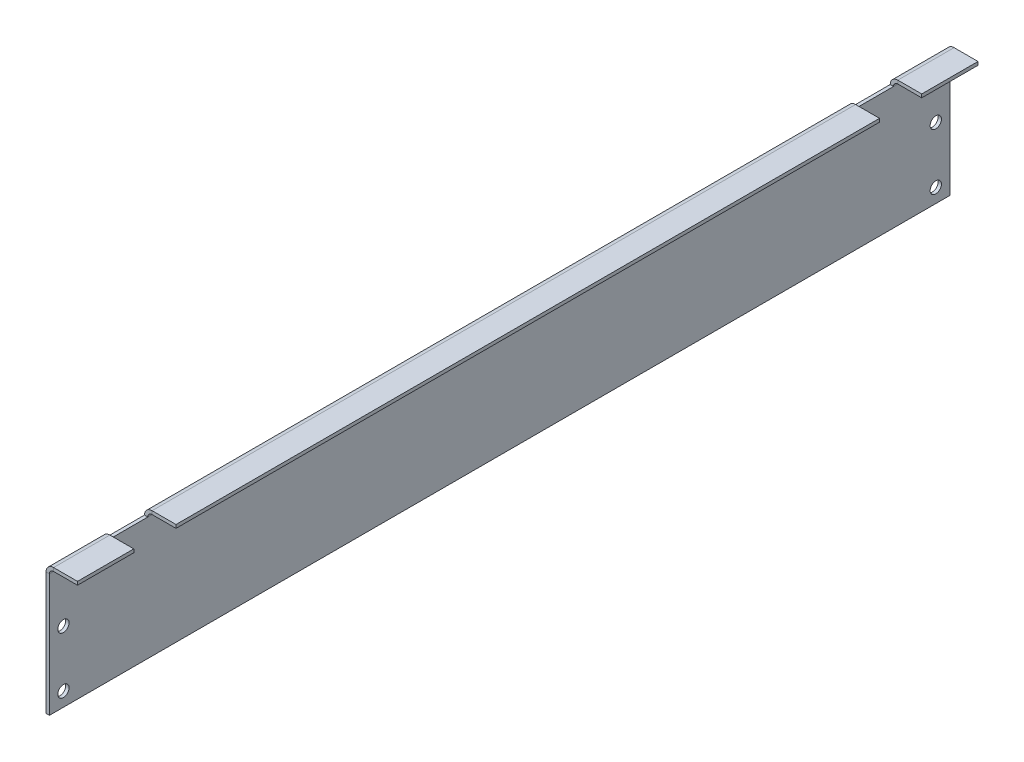
ISO-10303-21;
HEADER;
FILE_DESCRIPTION(('STEP AP214'),'2;1');
FILE_NAME('part.step','',(''),(''),'','','');
FILE_SCHEMA(('AUTOMOTIVE_DESIGN { 1 0 10303 214 1 1 1 1 }'));
ENDSEC;
DATA;
#1=APPLICATION_CONTEXT('core data for automotive mechanical design processes');
#2=APPLICATION_PROTOCOL_DEFINITION('international standard','automotive_design',2000,#1);
#3=PRODUCT_CONTEXT('',#1,'mechanical');
#4=PRODUCT('Part','Part','',(#3));
#5=PRODUCT_RELATED_PRODUCT_CATEGORY('part','',(#4));
#6=PRODUCT_DEFINITION_FORMATION('','',#4);
#7=PRODUCT_DEFINITION_CONTEXT('part definition',#1,'design');
#8=PRODUCT_DEFINITION('design','',#6,#7);
#9=PRODUCT_DEFINITION_SHAPE('','',#8);
#10=(LENGTH_UNIT() NAMED_UNIT(*) SI_UNIT(.MILLI.,.METRE.));
#11=(NAMED_UNIT(*) PLANE_ANGLE_UNIT() SI_UNIT($,.RADIAN.));
#12=(NAMED_UNIT(*) SI_UNIT($,.STERADIAN.) SOLID_ANGLE_UNIT());
#13=UNCERTAINTY_MEASURE_WITH_UNIT(LENGTH_MEASURE(1.E-05),#10,'distance_accuracy_value','');
#14=(GEOMETRIC_REPRESENTATION_CONTEXT(3) GLOBAL_UNCERTAINTY_ASSIGNED_CONTEXT((#13)) GLOBAL_UNIT_ASSIGNED_CONTEXT((#10,
#11,#12)) REPRESENTATION_CONTEXT('',''));
#15=CARTESIAN_POINT('',(0.,0.,0.));
#16=DIRECTION('',(0.,0.,1.));
#17=DIRECTION('',(1.,0.,0.));
#18=AXIS2_PLACEMENT_3D('',#15,#16,#17);
#19=CARTESIAN_POINT('',(12.7,25.94483,158.75));
#20=DIRECTION('',(0.,0.,-1.));
#21=DIRECTION('',(-1.,0.,0.));
#22=AXIS2_PLACEMENT_3D('',#19,#20,#21);
#23=PLANE('',#22);
#24=DIRECTION('',(-1.,0.,0.));
#25=VECTOR('',#24,1.);
#26=CARTESIAN_POINT('',(12.7,29.36875,158.75));
#27=LINE('',#26,#25);
#28=CARTESIAN_POINT('',(12.7,29.36875,158.75));
#29=VERTEX_POINT('',#28);
#30=CARTESIAN_POINT('',(1.90499999999999,29.36875,158.75));
#31=VERTEX_POINT('',#30);
#32=EDGE_CURVE('E200',#29,#31,#27,.T.);
#33=ORIENTED_EDGE('',*,*,#32,.T.);
#34=DIRECTION('',(0.,-1.,0.));
#35=VECTOR('',#34,1.);
#36=CARTESIAN_POINT('',(1.90499999999999,29.36875,158.75));
#37=LINE('',#36,#35);
#38=CARTESIAN_POINT('',(1.905,27.84983,158.75));
#39=VERTEX_POINT('',#38);
#40=EDGE_CURVE('E13',#31,#39,#37,.T.);
#41=ORIENTED_EDGE('',*,*,#40,.T.);
#42=DIRECTION('',(1.,0.,0.));
#43=VECTOR('',#42,1.);
#44=CARTESIAN_POINT('',(-1.04300248993106E-13,27.84983,158.75));
#45=LINE('',#44,#43);
#46=CARTESIAN_POINT('',(12.7,27.84983,158.75));
#47=VERTEX_POINT('',#46);
#48=EDGE_CURVE('E203',#39,#47,#45,.T.);
#49=ORIENTED_EDGE('',*,*,#48,.T.);
#50=DIRECTION('',(0.,-1.,0.));
#51=VECTOR('',#50,1.);
#52=CARTESIAN_POINT('',(12.7,25.94483,158.75));
#53=LINE('',#52,#51);
#54=EDGE_CURVE('E199',#29,#47,#53,.T.);
#55=ORIENTED_EDGE('',*,*,#54,.F.);
#56=EDGE_LOOP('',(#33,#41,#49,#55));
#57=FACE_BOUND('',#56,.T.);
#58=ADVANCED_FACE('F61',(#57),#23,.F.);
#59=CARTESIAN_POINT('',(12.7,25.94483,-177.8));
#60=DIRECTION('',(0.,0.,-1.));
#61=DIRECTION('',(-1.,0.,0.));
#62=AXIS2_PLACEMENT_3D('',#59,#60,#61);
#63=PLANE('',#62);
#64=DIRECTION('',(-1.,0.,0.));
#65=VECTOR('',#64,1.);
#66=CARTESIAN_POINT('',(12.7,29.36875,-177.8));
#67=LINE('',#66,#65);
#68=CARTESIAN_POINT('',(12.7,29.36875,-177.8));
#69=VERTEX_POINT('',#68);
#70=CARTESIAN_POINT('',(1.90499999999999,29.36875,-177.8));
#71=VERTEX_POINT('',#70);
#72=EDGE_CURVE('E316',#69,#71,#67,.T.);
#73=ORIENTED_EDGE('',*,*,#72,.T.);
#74=DIRECTION('',(0.,-1.,0.));
#75=VECTOR('',#74,1.);
#76=CARTESIAN_POINT('',(1.90499999999999,29.36875,-177.8));
#77=LINE('',#76,#75);
#78=CARTESIAN_POINT('',(1.90499999999999,27.84983,-177.8));
#79=VERTEX_POINT('',#78);
#80=EDGE_CURVE('E69',#71,#79,#77,.T.);
#81=ORIENTED_EDGE('',*,*,#80,.T.);
#82=DIRECTION('',(1.,0.,0.));
#83=VECTOR('',#82,1.);
#84=CARTESIAN_POINT('',(-1.04300248993106E-13,27.84983,-177.8));
#85=LINE('',#84,#83);
#86=CARTESIAN_POINT('',(12.7,27.84983,-177.8));
#87=VERTEX_POINT('',#86);
#88=EDGE_CURVE('E313',#79,#87,#85,.T.);
#89=ORIENTED_EDGE('',*,*,#88,.T.);
#90=DIRECTION('',(0.,-1.,0.));
#91=VECTOR('',#90,1.);
#92=CARTESIAN_POINT('',(12.7,25.94483,-177.8));
#93=LINE('',#92,#91);
#94=EDGE_CURVE('E365',#69,#87,#93,.T.);
#95=ORIENTED_EDGE('',*,*,#94,.F.);
#96=EDGE_LOOP('',(#73,#81,#89,#95));
#97=FACE_BOUND('',#96,.T.);
#98=ADVANCED_FACE('F311',(#97),#63,.F.);
#99=CARTESIAN_POINT('',(1.90500000000002,25.94483,203.2));
#100=DIRECTION('',(0.,0.,1.));
#101=DIRECTION('',(0.,1.,0.));
#102=AXIS2_PLACEMENT_3D('',#99,#100,#101);
#103=CYLINDRICAL_SURFACE('',#102,3.42392);
#104=CARTESIAN_POINT('',(1.90500000000002,25.94483,158.75));
#105=DIRECTION('',(0.,0.,-1.));
#106=DIRECTION('',(-1.,0.,0.));
#107=AXIS2_PLACEMENT_3D('',#104,#105,#106);
#108=CIRCLE('',#107,3.42392);
#109=CARTESIAN_POINT('',(-1.51892,25.94483,158.75));
#110=VERTEX_POINT('',#109);
#111=EDGE_CURVE('E374',#31,#110,#108,.F.);
#112=ORIENTED_EDGE('',*,*,#111,.F.);
#113=DIRECTION('',(0.,0.,1.));
#114=VECTOR('',#113,1.);
#115=CARTESIAN_POINT('',(1.90499999999999,29.36875,-203.2));
#116=LINE('',#115,#114);
#117=CARTESIAN_POINT('',(1.90499999999999,29.36875,-158.75));
#118=VERTEX_POINT('',#117);
#119=EDGE_CURVE('E211',#31,#118,#116,.F.);
#120=ORIENTED_EDGE('',*,*,#119,.T.);
#121=CARTESIAN_POINT('',(1.905,25.94483,-158.75));
#122=DIRECTION('',(0.,0.,1.));
#123=DIRECTION('',(1.,0.,0.));
#124=AXIS2_PLACEMENT_3D('',#121,#122,#123);
#125=CIRCLE('',#124,3.42392);
#126=CARTESIAN_POINT('',(-1.51892,25.94483,-158.75));
#127=VERTEX_POINT('',#126);
#128=EDGE_CURVE('E333',#127,#118,#125,.F.);
#129=ORIENTED_EDGE('',*,*,#128,.F.);
#130=DIRECTION('',(0.,0.,1.));
#131=VECTOR('',#130,1.);
#132=CARTESIAN_POINT('',(-1.51891999999998,25.94483,203.2));
#133=LINE('',#132,#131);
#134=EDGE_CURVE('E258',#110,#127,#133,.F.);
#135=ORIENTED_EDGE('',*,*,#134,.F.);
#136=EDGE_LOOP('',(#112,#120,#129,#135));
#137=FACE_BOUND('',#136,.T.);
#138=ADVANCED_FACE('F506',(#137),#103,.T.);
#139=CARTESIAN_POINT('',(1.90500000000002,25.94483,203.2));
#140=DIRECTION('',(0.,0.,1.));
#141=DIRECTION('',(0.,1.,0.));
#142=AXIS2_PLACEMENT_3D('',#139,#140,#141);
#143=CYLINDRICAL_SURFACE('',#142,1.905);
#144=DIRECTION('',(0.,0.,1.));
#145=VECTOR('',#144,1.);
#146=CARTESIAN_POINT('',(1.90499999999999,27.84983,-203.2));
#147=LINE('',#146,#145);
#148=CARTESIAN_POINT('',(1.90499999999999,27.84983,-158.75));
#149=VERTEX_POINT('',#148);
#150=EDGE_CURVE('E248',#149,#39,#147,.T.);
#151=ORIENTED_EDGE('',*,*,#150,.T.);
#152=CARTESIAN_POINT('',(1.90500000000002,25.94483,158.75));
#153=DIRECTION('',(0.,0.,-1.));
#154=DIRECTION('',(-1.,0.,0.));
#155=AXIS2_PLACEMENT_3D('',#152,#153,#154);
#156=CIRCLE('',#155,1.905);
#157=CARTESIAN_POINT('',(0.,25.94483,158.75));
#158=VERTEX_POINT('',#157);
#159=EDGE_CURVE('E377',#39,#158,#156,.F.);
#160=ORIENTED_EDGE('',*,*,#159,.T.);
#161=DIRECTION('',(0.,0.,1.));
#162=VECTOR('',#161,1.);
#163=CARTESIAN_POINT('',(0.,25.94483,203.2));
#164=LINE('',#163,#162);
#165=CARTESIAN_POINT('',(0.,25.94483,-158.75));
#166=VERTEX_POINT('',#165);
#167=EDGE_CURVE('E273',#158,#166,#164,.F.);
#168=ORIENTED_EDGE('',*,*,#167,.T.);
#169=CARTESIAN_POINT('',(1.905,25.94483,-158.75));
#170=DIRECTION('',(0.,0.,1.));
#171=DIRECTION('',(1.,0.,0.));
#172=AXIS2_PLACEMENT_3D('',#169,#170,#171);
#173=CIRCLE('',#172,1.905);
#174=EDGE_CURVE('E358',#166,#149,#173,.F.);
#175=ORIENTED_EDGE('',*,*,#174,.T.);
#176=EDGE_LOOP('',(#151,#160,#168,#175));
#177=FACE_BOUND('',#176,.T.);
#178=ADVANCED_FACE('F478',(#177),#143,.F.);
#179=CARTESIAN_POINT('',(-1.09603529828301E-13,29.36875,0.));
#180=DIRECTION('',(0.,-1.,0.));
#181=DIRECTION('',(1.,0.,0.));
#182=AXIS2_PLACEMENT_3D('',#179,#180,#181);
#183=PLANE('',#182);
#184=ORIENTED_EDGE('',*,*,#119,.F.);
#185=ORIENTED_EDGE('',*,*,#32,.F.);
#186=DIRECTION('',(0.,0.,-1.));
#187=VECTOR('',#186,1.);
#188=CARTESIAN_POINT('',(12.7,29.36875,0.));
#189=LINE('',#188,#187);
#190=CARTESIAN_POINT('',(12.7,29.36875,-158.75));
#191=VERTEX_POINT('',#190);
#192=EDGE_CURVE('E84',#29,#191,#189,.T.);
#193=ORIENTED_EDGE('',*,*,#192,.T.);
#194=DIRECTION('',(-1.,0.,0.));
#195=VECTOR('',#194,1.);
#196=CARTESIAN_POINT('',(12.7,29.36875,-158.75));
#197=LINE('',#196,#195);
#198=EDGE_CURVE('E368',#191,#118,#197,.T.);
#199=ORIENTED_EDGE('',*,*,#198,.T.);
#200=EDGE_LOOP('',(#184,#185,#193,#199));
#201=FACE_BOUND('',#200,.T.);
#202=ADVANCED_FACE('F210',(#201),#183,.F.);
#203=CARTESIAN_POINT('',(-1.04300248993106E-13,27.84983,0.));
#204=DIRECTION('',(0.,-1.,0.));
#205=DIRECTION('',(1.,0.,0.));
#206=AXIS2_PLACEMENT_3D('',#203,#204,#205);
#207=PLANE('',#206);
#208=ORIENTED_EDGE('',*,*,#48,.F.);
#209=ORIENTED_EDGE('',*,*,#150,.F.);
#210=DIRECTION('',(-1.,0.,0.));
#211=VECTOR('',#210,1.);
#212=CARTESIAN_POINT('',(-1.04300248993106E-13,27.84983,-158.75));
#213=LINE('',#212,#211);
#214=CARTESIAN_POINT('',(12.7,27.84983,-158.75));
#215=VERTEX_POINT('',#214);
#216=EDGE_CURVE('E361',#215,#149,#213,.T.);
#217=ORIENTED_EDGE('',*,*,#216,.F.);
#218=DIRECTION('',(0.,0.,1.));
#219=VECTOR('',#218,1.);
#220=CARTESIAN_POINT('',(12.7,27.84983,-203.2));
#221=LINE('',#220,#219);
#222=EDGE_CURVE('E234',#47,#215,#221,.F.);
#223=ORIENTED_EDGE('',*,*,#222,.F.);
#224=EDGE_LOOP('',(#208,#209,#217,#223));
#225=FACE_BOUND('',#224,.T.);
#226=ADVANCED_FACE('F484',(#225),#207,.T.);
#227=CARTESIAN_POINT('',(12.7,29.36875,-203.2));
#228=DIRECTION('',(-1.,0.,0.));
#229=DIRECTION('',(0.,-1.,0.));
#230=AXIS2_PLACEMENT_3D('',#227,#228,#229);
#231=PLANE('',#230);
#232=ORIENTED_EDGE('',*,*,#192,.F.);
#233=ORIENTED_EDGE('',*,*,#54,.T.);
#234=ORIENTED_EDGE('',*,*,#222,.T.);
#235=DIRECTION('',(0.,1.,0.));
#236=VECTOR('',#235,1.);
#237=CARTESIAN_POINT('',(12.7,29.36875,-158.75));
#238=LINE('',#237,#236);
#239=EDGE_CURVE('E217',#215,#191,#238,.T.);
#240=ORIENTED_EDGE('',*,*,#239,.T.);
#241=EDGE_LOOP('',(#232,#233,#234,#240));
#242=FACE_BOUND('',#241,.T.);
#243=ADVANCED_FACE('F215',(#242),#231,.F.);
#244=CARTESIAN_POINT('',(1.905,25.94483,-177.8));
#245=DIRECTION('',(0.,0.,-1.));
#246=DIRECTION('',(-1.,0.,0.));
#247=AXIS2_PLACEMENT_3D('',#244,#245,#246);
#248=CIRCLE('',#247,3.42392);
#249=CARTESIAN_POINT('',(-1.51892,25.94483,-177.8));
#250=VERTEX_POINT('',#249);
#251=EDGE_CURVE('E253',#71,#250,#248,.F.);
#252=ORIENTED_EDGE('',*,*,#251,.F.);
#253=CARTESIAN_POINT('',(1.90499999999999,29.36875,-203.2));
#254=VERTEX_POINT('',#253);
#255=EDGE_CURVE('E241',#71,#254,#116,.F.);
#256=ORIENTED_EDGE('',*,*,#255,.T.);
#257=CARTESIAN_POINT('',(1.905,25.94483,-203.2));
#258=DIRECTION('',(0.,0.,1.));
#259=DIRECTION('',(1.,0.,0.));
#260=AXIS2_PLACEMENT_3D('',#257,#258,#259);
#261=CIRCLE('',#260,3.42392);
#262=CARTESIAN_POINT('',(-1.51892,25.94483,-203.2));
#263=VERTEX_POINT('',#262);
#264=EDGE_CURVE('E257',#263,#254,#261,.F.);
#265=ORIENTED_EDGE('',*,*,#264,.F.);
#266=EDGE_CURVE('E259',#250,#263,#133,.F.);
#267=ORIENTED_EDGE('',*,*,#266,.F.);
#268=EDGE_LOOP('',(#252,#256,#265,#267));
#269=FACE_BOUND('',#268,.T.);
#270=ADVANCED_FACE('F499',(#269),#103,.T.);
#271=CARTESIAN_POINT('',(1.90499999999999,27.84983,-203.2));
#272=VERTEX_POINT('',#271);
#273=EDGE_CURVE('E245',#272,#79,#147,.T.);
#274=ORIENTED_EDGE('',*,*,#273,.T.);
#275=CARTESIAN_POINT('',(1.905,25.94483,-177.8));
#276=DIRECTION('',(0.,0.,-1.));
#277=DIRECTION('',(-1.,0.,0.));
#278=AXIS2_PLACEMENT_3D('',#275,#276,#277);
#279=CIRCLE('',#278,1.905);
#280=CARTESIAN_POINT('',(0.,25.94483,-177.8));
#281=VERTEX_POINT('',#280);
#282=EDGE_CURVE('E321',#79,#281,#279,.F.);
#283=ORIENTED_EDGE('',*,*,#282,.T.);
#284=CARTESIAN_POINT('',(0.,25.94483,-203.2));
#285=VERTEX_POINT('',#284);
#286=EDGE_CURVE('E278',#281,#285,#164,.F.);
#287=ORIENTED_EDGE('',*,*,#286,.T.);
#288=CARTESIAN_POINT('',(1.905,25.94483,-203.2));
#289=DIRECTION('',(0.,0.,1.));
#290=DIRECTION('',(1.,0.,0.));
#291=AXIS2_PLACEMENT_3D('',#288,#289,#290);
#292=CIRCLE('',#291,1.905);
#293=EDGE_CURVE('E266',#285,#272,#292,.F.);
#294=ORIENTED_EDGE('',*,*,#293,.T.);
#295=EDGE_LOOP('',(#274,#283,#287,#294));
#296=FACE_BOUND('',#295,.T.);
#297=ADVANCED_FACE('F335',(#296),#143,.F.);
#298=ORIENTED_EDGE('',*,*,#255,.F.);
#299=ORIENTED_EDGE('',*,*,#72,.F.);
#300=CARTESIAN_POINT('',(12.7,29.36875,-203.2));
#301=VERTEX_POINT('',#300);
#302=EDGE_CURVE('E219',#69,#301,#189,.T.);
#303=ORIENTED_EDGE('',*,*,#302,.T.);
#304=DIRECTION('',(-1.,0.,0.));
#305=VECTOR('',#304,1.);
#306=CARTESIAN_POINT('',(7.78574889871821E-13,29.36875,-203.2));
#307=LINE('',#306,#305);
#308=EDGE_CURVE('E222',#301,#254,#307,.T.);
#309=ORIENTED_EDGE('',*,*,#308,.T.);
#310=EDGE_LOOP('',(#298,#299,#303,#309));
#311=FACE_BOUND('',#310,.T.);
#312=ADVANCED_FACE('F348',(#311),#183,.F.);
#313=ORIENTED_EDGE('',*,*,#88,.F.);
#314=ORIENTED_EDGE('',*,*,#273,.F.);
#315=DIRECTION('',(1.,0.,0.));
#316=VECTOR('',#315,1.);
#317=CARTESIAN_POINT('',(0.,27.84983,-203.2));
#318=LINE('',#317,#316);
#319=CARTESIAN_POINT('',(12.7,27.84983,-203.2));
#320=VERTEX_POINT('',#319);
#321=EDGE_CURVE('E228',#320,#272,#318,.F.);
#322=ORIENTED_EDGE('',*,*,#321,.F.);
#323=EDGE_CURVE('E235',#87,#320,#221,.F.);
#324=ORIENTED_EDGE('',*,*,#323,.F.);
#325=EDGE_LOOP('',(#313,#314,#322,#324));
#326=FACE_BOUND('',#325,.T.);
#327=ADVANCED_FACE('F331',(#326),#207,.T.);
#328=ORIENTED_EDGE('',*,*,#302,.F.);
#329=ORIENTED_EDGE('',*,*,#94,.T.);
#330=ORIENTED_EDGE('',*,*,#323,.T.);
#331=DIRECTION('',(0.,-1.,0.));
#332=VECTOR('',#331,1.);
#333=CARTESIAN_POINT('',(12.7,29.36875,-203.2));
#334=LINE('',#333,#332);
#335=EDGE_CURVE('E351',#301,#320,#334,.T.);
#336=ORIENTED_EDGE('',*,*,#335,.F.);
#337=EDGE_LOOP('',(#328,#329,#330,#336));
#338=FACE_BOUND('',#337,.T.);
#339=ADVANCED_FACE('F486',(#338),#231,.F.);
#340=CARTESIAN_POINT('',(-1.51892,29.36875,203.2));
#341=DIRECTION('',(0.,0.,1.));
#342=DIRECTION('',(1.,0.,0.));
#343=AXIS2_PLACEMENT_3D('',#340,#341,#342);
#344=PLANE('',#343);
#345=DIRECTION('',(0.,-1.,0.));
#346=VECTOR('',#345,1.);
#347=CARTESIAN_POINT('',(0.,29.36875,203.2));
#348=LINE('',#347,#346);
#349=CARTESIAN_POINT('',(0.,25.94483,203.2));
#350=VERTEX_POINT('',#349);
#351=CARTESIAN_POINT('',(0.,-29.36875,203.2));
#352=VERTEX_POINT('',#351);
#353=EDGE_CURVE('E298',#350,#352,#348,.T.);
#354=ORIENTED_EDGE('',*,*,#353,.F.);
#355=DIRECTION('',(-1.,0.,0.));
#356=VECTOR('',#355,1.);
#357=CARTESIAN_POINT('',(0.,25.94483,203.2));
#358=LINE('',#357,#356);
#359=CARTESIAN_POINT('',(-1.51891999999998,25.94483,203.2));
#360=VERTEX_POINT('',#359);
#361=EDGE_CURVE('E262',#350,#360,#358,.T.);
#362=ORIENTED_EDGE('',*,*,#361,.T.);
#363=DIRECTION('',(0.,-1.,0.));
#364=VECTOR('',#363,1.);
#365=CARTESIAN_POINT('',(-1.51892,29.36875,203.2));
#366=LINE('',#365,#364);
#367=CARTESIAN_POINT('',(-1.51892,-29.36875,203.2));
#368=VERTEX_POINT('',#367);
#369=EDGE_CURVE('E289',#360,#368,#366,.T.);
#370=ORIENTED_EDGE('',*,*,#369,.T.);
#371=DIRECTION('',(1.,0.,0.));
#372=VECTOR('',#371,1.);
#373=CARTESIAN_POINT('',(-1.51892,-29.36875,203.2));
#374=LINE('',#373,#372);
#375=EDGE_CURVE('E295',#368,#352,#374,.T.);
#376=ORIENTED_EDGE('',*,*,#375,.T.);
#377=EDGE_LOOP('',(#354,#362,#370,#376));
#378=FACE_BOUND('',#377,.T.);
#379=ADVANCED_FACE('F446',(#378),#344,.T.);
#380=CARTESIAN_POINT('',(-1.51892,0.,0.));
#381=DIRECTION('',(1.,0.,0.));
#382=DIRECTION('',(0.,0.,-1.));
#383=AXIS2_PLACEMENT_3D('',#380,#381,#382);
#384=PLANE('',#383);
#385=CARTESIAN_POINT('',(-1.51892,2.38125,196.85));
#386=DIRECTION('',(1.,0.,0.));
#387=DIRECTION('',(0.,0.,-1.));
#388=AXIS2_PLACEMENT_3D('',#385,#386,#387);
#389=CIRCLE('',#388,2.55269999999999);
#390=CARTESIAN_POINT('',(-1.51892,2.38125,194.2973));
#391=VERTEX_POINT('',#390);
#392=EDGE_CURVE('E412',#391,#391,#389,.T.);
#393=ORIENTED_EDGE('',*,*,#392,.T.);
#394=EDGE_LOOP('',(#393));
#395=FACE_BOUND('',#394,.T.);
#396=CARTESIAN_POINT('',(-1.51892,-23.01875,-196.85));
#397=DIRECTION('',(1.,0.,0.));
#398=DIRECTION('',(0.,0.,-1.));
#399=AXIS2_PLACEMENT_3D('',#396,#397,#398);
#400=CIRCLE('',#399,2.55269999999999);
#401=CARTESIAN_POINT('',(-1.51892,-23.01875,-199.4027));
#402=VERTEX_POINT('',#401);
#403=EDGE_CURVE('E406',#402,#402,#400,.T.);
#404=ORIENTED_EDGE('',*,*,#403,.T.);
#405=EDGE_LOOP('',(#404));
#406=FACE_BOUND('',#405,.T.);
#407=CARTESIAN_POINT('',(-1.51892,-23.01875,196.85));
#408=DIRECTION('',(1.,0.,0.));
#409=DIRECTION('',(0.,0.,-1.));
#410=AXIS2_PLACEMENT_3D('',#407,#408,#409);
#411=CIRCLE('',#410,2.55269999999999);
#412=CARTESIAN_POINT('',(-1.51892,-23.01875,194.2973));
#413=VERTEX_POINT('',#412);
#414=EDGE_CURVE('E400',#413,#413,#411,.T.);
#415=ORIENTED_EDGE('',*,*,#414,.T.);
#416=EDGE_LOOP('',(#415));
#417=FACE_BOUND('',#416,.T.);
#418=CARTESIAN_POINT('',(-1.51892,2.38125,-196.85));
#419=DIRECTION('',(1.,0.,0.));
#420=DIRECTION('',(0.,0.,-1.));
#421=AXIS2_PLACEMENT_3D('',#418,#419,#420);
#422=CIRCLE('',#421,2.55269999999999);
#423=CARTESIAN_POINT('',(-1.51892,2.38125,-199.4027));
#424=VERTEX_POINT('',#423);
#425=EDGE_CURVE('E393',#424,#424,#422,.T.);
#426=ORIENTED_EDGE('',*,*,#425,.T.);
#427=EDGE_LOOP('',(#426));
#428=FACE_BOUND('',#427,.T.);
#429=CARTESIAN_POINT('',(-1.51892,25.94483,177.8));
#430=VERTEX_POINT('',#429);
#431=EDGE_CURVE('E254',#360,#430,#133,.F.);
#432=ORIENTED_EDGE('',*,*,#431,.T.);
#433=DIRECTION('',(0.,0.,1.));
#434=VECTOR('',#433,1.);
#435=CARTESIAN_POINT('',(-1.51892,25.94483,158.75));
#436=LINE('',#435,#434);
#437=EDGE_CURVE('E207',#110,#430,#436,.T.);
#438=ORIENTED_EDGE('',*,*,#437,.F.);
#439=ORIENTED_EDGE('',*,*,#134,.T.);
#440=DIRECTION('',(0.,0.,1.));
#441=VECTOR('',#440,1.);
#442=CARTESIAN_POINT('',(-1.51892,25.94483,-177.8));
#443=LINE('',#442,#441);
#444=EDGE_CURVE('E371',#250,#127,#443,.T.);
#445=ORIENTED_EDGE('',*,*,#444,.F.);
#446=ORIENTED_EDGE('',*,*,#266,.T.);
#447=DIRECTION('',(0.,1.,0.));
#448=VECTOR('',#447,1.);
#449=CARTESIAN_POINT('',(-1.51892,29.36875,-203.2));
#450=LINE('',#449,#448);
#451=CARTESIAN_POINT('',(-1.51892,-29.36875,-203.2));
#452=VERTEX_POINT('',#451);
#453=EDGE_CURVE('E286',#452,#263,#450,.T.);
#454=ORIENTED_EDGE('',*,*,#453,.F.);
#455=DIRECTION('',(0.,0.,-1.));
#456=VECTOR('',#455,1.);
#457=CARTESIAN_POINT('',(-1.51892,-29.36875,203.2));
#458=LINE('',#457,#456);
#459=EDGE_CURVE('E292',#368,#452,#458,.T.);
#460=ORIENTED_EDGE('',*,*,#459,.F.);
#461=ORIENTED_EDGE('',*,*,#369,.F.);
#462=EDGE_LOOP('',(#432,#438,#439,#445,#446,#454,#460,#461));
#463=FACE_BOUND('',#462,.T.);
#464=ADVANCED_FACE('F424',(#395,#406,#417,#428,#463),#384,.F.);
#465=CARTESIAN_POINT('',(0.,0.,0.));
#466=DIRECTION('',(1.,0.,0.));
#467=DIRECTION('',(0.,0.,-1.));
#468=AXIS2_PLACEMENT_3D('',#465,#466,#467);
#469=PLANE('',#468);
#470=CARTESIAN_POINT('',(0.,2.38125,196.85));
#471=DIRECTION('',(1.,0.,0.));
#472=DIRECTION('',(0.,0.,-1.));
#473=AXIS2_PLACEMENT_3D('',#470,#471,#472);
#474=CIRCLE('',#473,2.55269999999999);
#475=CARTESIAN_POINT('',(0.,2.38125,194.2973));
#476=VERTEX_POINT('',#475);
#477=EDGE_CURVE('E415',#476,#476,#474,.T.);
#478=ORIENTED_EDGE('',*,*,#477,.F.);
#479=EDGE_LOOP('',(#478));
#480=FACE_BOUND('',#479,.T.);
#481=CARTESIAN_POINT('',(0.,-23.01875,-196.85));
#482=DIRECTION('',(1.,0.,0.));
#483=DIRECTION('',(0.,0.,-1.));
#484=AXIS2_PLACEMENT_3D('',#481,#482,#483);
#485=CIRCLE('',#484,2.55269999999999);
#486=CARTESIAN_POINT('',(0.,-23.01875,-199.4027));
#487=VERTEX_POINT('',#486);
#488=EDGE_CURVE('E409',#487,#487,#485,.T.);
#489=ORIENTED_EDGE('',*,*,#488,.F.);
#490=EDGE_LOOP('',(#489));
#491=FACE_BOUND('',#490,.T.);
#492=CARTESIAN_POINT('',(0.,-23.01875,196.85));
#493=DIRECTION('',(1.,0.,0.));
#494=DIRECTION('',(0.,0.,-1.));
#495=AXIS2_PLACEMENT_3D('',#492,#493,#494);
#496=CIRCLE('',#495,2.55269999999999);
#497=CARTESIAN_POINT('',(0.,-23.01875,194.2973));
#498=VERTEX_POINT('',#497);
#499=EDGE_CURVE('E403',#498,#498,#496,.T.);
#500=ORIENTED_EDGE('',*,*,#499,.F.);
#501=EDGE_LOOP('',(#500));
#502=FACE_BOUND('',#501,.T.);
#503=CARTESIAN_POINT('',(0.,2.38125,-196.85));
#504=DIRECTION('',(1.,0.,0.));
#505=DIRECTION('',(0.,0.,-1.));
#506=AXIS2_PLACEMENT_3D('',#503,#504,#505);
#507=CIRCLE('',#506,2.55269999999999);
#508=CARTESIAN_POINT('',(0.,2.38125,-199.4027));
#509=VERTEX_POINT('',#508);
#510=EDGE_CURVE('E397',#509,#509,#507,.T.);
#511=ORIENTED_EDGE('',*,*,#510,.F.);
#512=EDGE_LOOP('',(#511));
#513=FACE_BOUND('',#512,.T.);
#514=DIRECTION('',(0.,1.,0.));
#515=VECTOR('',#514,1.);
#516=CARTESIAN_POINT('',(0.,29.36875,-203.2));
#517=LINE('',#516,#515);
#518=CARTESIAN_POINT('',(0.,-29.36875,-203.2));
#519=VERTEX_POINT('',#518);
#520=EDGE_CURVE('E283',#519,#285,#517,.T.);
#521=ORIENTED_EDGE('',*,*,#520,.T.);
#522=ORIENTED_EDGE('',*,*,#286,.F.);
#523=EDGE_CURVE('E274',#166,#281,#164,.F.);
#524=ORIENTED_EDGE('',*,*,#523,.F.);
#525=ORIENTED_EDGE('',*,*,#167,.F.);
#526=CARTESIAN_POINT('',(0.,25.94483,177.8));
#527=VERTEX_POINT('',#526);
#528=EDGE_CURVE('E272',#527,#158,#164,.F.);
#529=ORIENTED_EDGE('',*,*,#528,.F.);
#530=EDGE_CURVE('E269',#350,#527,#164,.F.);
#531=ORIENTED_EDGE('',*,*,#530,.F.);
#532=ORIENTED_EDGE('',*,*,#353,.T.);
#533=DIRECTION('',(0.,0.,-1.));
#534=VECTOR('',#533,1.);
#535=CARTESIAN_POINT('',(0.,-29.36875,203.2));
#536=LINE('',#535,#534);
#537=EDGE_CURVE('E290',#352,#519,#536,.T.);
#538=ORIENTED_EDGE('',*,*,#537,.T.);
#539=EDGE_LOOP('',(#521,#522,#524,#525,#529,#531,#532,#538));
#540=FACE_BOUND('',#539,.T.);
#541=ADVANCED_FACE('F421',(#480,#491,#502,#513,#540),#469,.T.);
#542=CARTESIAN_POINT('',(-1.51892,29.36875,-203.2));
#543=DIRECTION('',(0.,0.,-1.));
#544=DIRECTION('',(-1.,0.,0.));
#545=AXIS2_PLACEMENT_3D('',#542,#543,#544);
#546=PLANE('',#545);
#547=DIRECTION('',(-1.,0.,0.));
#548=VECTOR('',#547,1.);
#549=CARTESIAN_POINT('',(0.,25.94483,-203.2));
#550=LINE('',#549,#548);
#551=EDGE_CURVE('E280',#285,#263,#550,.T.);
#552=ORIENTED_EDGE('',*,*,#551,.F.);
#553=ORIENTED_EDGE('',*,*,#520,.F.);
#554=DIRECTION('',(1.,0.,0.));
#555=VECTOR('',#554,1.);
#556=CARTESIAN_POINT('',(-1.51892,-29.36875,-203.2));
#557=LINE('',#556,#555);
#558=EDGE_CURVE('E302',#452,#519,#557,.T.);
#559=ORIENTED_EDGE('',*,*,#558,.F.);
#560=ORIENTED_EDGE('',*,*,#453,.T.);
#561=EDGE_LOOP('',(#552,#553,#559,#560));
#562=FACE_BOUND('',#561,.T.);
#563=ADVANCED_FACE('F63',(#562),#546,.T.);
#564=CARTESIAN_POINT('',(-1.51892,-29.36875,203.2));
#565=DIRECTION('',(0.,-1.,0.));
#566=DIRECTION('',(0.,0.,-1.));
#567=AXIS2_PLACEMENT_3D('',#564,#565,#566);
#568=PLANE('',#567);
#569=ORIENTED_EDGE('',*,*,#537,.F.);
#570=ORIENTED_EDGE('',*,*,#375,.F.);
#571=ORIENTED_EDGE('',*,*,#459,.T.);
#572=ORIENTED_EDGE('',*,*,#558,.T.);
#573=EDGE_LOOP('',(#569,#570,#571,#572));
#574=FACE_BOUND('',#573,.T.);
#575=ADVANCED_FACE('F443',(#574),#568,.T.);
#576=CARTESIAN_POINT('',(1.905,25.94483,-203.2));
#577=DIRECTION('',(0.,0.,-1.));
#578=DIRECTION('',(-1.,0.,0.));
#579=AXIS2_PLACEMENT_3D('',#576,#577,#578);
#580=PLANE('',#579);
#581=DIRECTION('',(0.,-1.,0.));
#582=VECTOR('',#581,1.);
#583=CARTESIAN_POINT('',(1.90499999999999,29.36875,-203.2));
#584=LINE('',#583,#582);
#585=EDGE_CURVE('E250',#272,#254,#584,.F.);
#586=ORIENTED_EDGE('',*,*,#585,.F.);
#587=ORIENTED_EDGE('',*,*,#293,.F.);
#588=ORIENTED_EDGE('',*,*,#551,.T.);
#589=ORIENTED_EDGE('',*,*,#264,.T.);
#590=EDGE_LOOP('',(#586,#587,#588,#589));
#591=FACE_BOUND('',#590,.T.);
#592=ADVANCED_FACE('F339',(#591),#580,.T.);
#593=CARTESIAN_POINT('',(1.90500000000002,25.94483,203.2));
#594=DIRECTION('',(0.,0.,-1.));
#595=DIRECTION('',(-1.,0.,0.));
#596=AXIS2_PLACEMENT_3D('',#593,#594,#595);
#597=PLANE('',#596);
#598=CARTESIAN_POINT('',(1.90500000000002,25.94483,203.2));
#599=DIRECTION('',(0.,0.,1.));
#600=DIRECTION('',(1.,0.,0.));
#601=AXIS2_PLACEMENT_3D('',#598,#599,#600);
#602=CIRCLE('',#601,1.905);
#603=CARTESIAN_POINT('',(1.90500000000001,27.84983,203.2));
#604=VERTEX_POINT('',#603);
#605=EDGE_CURVE('E275',#604,#350,#602,.T.);
#606=ORIENTED_EDGE('',*,*,#605,.F.);
#607=DIRECTION('',(0.,-1.,0.));
#608=VECTOR('',#607,1.);
#609=CARTESIAN_POINT('',(1.90500000000001,27.84983,203.2));
#610=LINE('',#609,#608);
#611=CARTESIAN_POINT('',(1.90500000000001,29.36875,203.2));
#612=VERTEX_POINT('',#611);
#613=EDGE_CURVE('E242',#604,#612,#610,.F.);
#614=ORIENTED_EDGE('',*,*,#613,.T.);
#615=CARTESIAN_POINT('',(1.90500000000002,25.94483,203.2));
#616=DIRECTION('',(0.,0.,1.));
#617=DIRECTION('',(1.,0.,0.));
#618=AXIS2_PLACEMENT_3D('',#615,#616,#617);
#619=CIRCLE('',#618,3.42392);
#620=EDGE_CURVE('E263',#612,#360,#619,.T.);
#621=ORIENTED_EDGE('',*,*,#620,.T.);
#622=ORIENTED_EDGE('',*,*,#361,.F.);
#623=EDGE_LOOP('',(#606,#614,#621,#622));
#624=FACE_BOUND('',#623,.T.);
#625=ADVANCED_FACE('F455',(#624),#597,.F.);
#626=CARTESIAN_POINT('',(1.90500000000002,25.94483,177.8));
#627=DIRECTION('',(0.,0.,1.));
#628=DIRECTION('',(1.,0.,0.));
#629=AXIS2_PLACEMENT_3D('',#626,#627,#628);
#630=CIRCLE('',#629,3.42392);
#631=CARTESIAN_POINT('',(1.90499999999999,29.36875,177.8));
#632=VERTEX_POINT('',#631);
#633=EDGE_CURVE('E381',#430,#632,#630,.F.);
#634=ORIENTED_EDGE('',*,*,#633,.F.);
#635=ORIENTED_EDGE('',*,*,#431,.F.);
#636=ORIENTED_EDGE('',*,*,#620,.F.);
#637=EDGE_CURVE('E238',#612,#632,#116,.F.);
#638=ORIENTED_EDGE('',*,*,#637,.T.);
#639=EDGE_LOOP('',(#634,#635,#636,#638));
#640=FACE_BOUND('',#639,.T.);
#641=ADVANCED_FACE('F452',(#640),#103,.T.);
#642=ORIENTED_EDGE('',*,*,#530,.T.);
#643=CARTESIAN_POINT('',(1.90500000000002,25.94483,177.8));
#644=DIRECTION('',(0.,0.,1.));
#645=DIRECTION('',(1.,0.,0.));
#646=AXIS2_PLACEMENT_3D('',#643,#644,#645);
#647=CIRCLE('',#646,1.905);
#648=CARTESIAN_POINT('',(1.905,27.84983,177.8));
#649=VERTEX_POINT('',#648);
#650=EDGE_CURVE('E383',#527,#649,#647,.F.);
#651=ORIENTED_EDGE('',*,*,#650,.T.);
#652=EDGE_CURVE('E249',#649,#604,#147,.T.);
#653=ORIENTED_EDGE('',*,*,#652,.T.);
#654=ORIENTED_EDGE('',*,*,#605,.T.);
#655=EDGE_LOOP('',(#642,#651,#653,#654));
#656=FACE_BOUND('',#655,.T.);
#657=ADVANCED_FACE('F537',(#656),#143,.F.);
#658=CARTESIAN_POINT('',(12.7,29.36875,203.2));
#659=DIRECTION('',(0.,0.,-1.));
#660=DIRECTION('',(-1.,0.,0.));
#661=AXIS2_PLACEMENT_3D('',#658,#659,#660);
#662=PLANE('',#661);
#663=ORIENTED_EDGE('',*,*,#613,.F.);
#664=DIRECTION('',(-1.,0.,0.));
#665=VECTOR('',#664,1.);
#666=CARTESIAN_POINT('',(12.7,27.84983,203.2));
#667=LINE('',#666,#665);
#668=CARTESIAN_POINT('',(12.7,27.84983,203.2));
#669=VERTEX_POINT('',#668);
#670=EDGE_CURVE('E236',#604,#669,#667,.F.);
#671=ORIENTED_EDGE('',*,*,#670,.T.);
#672=DIRECTION('',(0.,-1.,0.));
#673=VECTOR('',#672,1.);
#674=CARTESIAN_POINT('',(12.7,29.36875,203.2));
#675=LINE('',#674,#673);
#676=CARTESIAN_POINT('',(12.7,29.36875,203.2));
#677=VERTEX_POINT('',#676);
#678=EDGE_CURVE('E279',#677,#669,#675,.T.);
#679=ORIENTED_EDGE('',*,*,#678,.F.);
#680=DIRECTION('',(1.,0.,0.));
#681=VECTOR('',#680,1.);
#682=CARTESIAN_POINT('',(-9.97781949528426E-13,29.36875,203.2));
#683=LINE('',#682,#681);
#684=EDGE_CURVE('E223',#612,#677,#683,.T.);
#685=ORIENTED_EDGE('',*,*,#684,.F.);
#686=EDGE_LOOP('',(#663,#671,#679,#685));
#687=FACE_BOUND('',#686,.T.);
#688=ADVANCED_FACE('F464',(#687),#662,.F.);
#689=CARTESIAN_POINT('',(0.,29.36875,-203.2));
#690=DIRECTION('',(0.,0.,1.));
#691=DIRECTION('',(1.,0.,0.));
#692=AXIS2_PLACEMENT_3D('',#689,#690,#691);
#693=PLANE('',#692);
#694=ORIENTED_EDGE('',*,*,#585,.T.);
#695=ORIENTED_EDGE('',*,*,#308,.F.);
#696=ORIENTED_EDGE('',*,*,#335,.T.);
#697=ORIENTED_EDGE('',*,*,#321,.T.);
#698=EDGE_LOOP('',(#694,#695,#696,#697));
#699=FACE_BOUND('',#698,.T.);
#700=ADVANCED_FACE('F344',(#699),#693,.F.);
#701=CARTESIAN_POINT('',(12.7,29.36875,177.8));
#702=VERTEX_POINT('',#701);
#703=EDGE_CURVE('E218',#677,#702,#189,.T.);
#704=ORIENTED_EDGE('',*,*,#703,.T.);
#705=DIRECTION('',(-1.,0.,0.));
#706=VECTOR('',#705,1.);
#707=CARTESIAN_POINT('',(12.7,29.36875,177.8));
#708=LINE('',#707,#706);
#709=EDGE_CURVE('E76',#702,#632,#708,.T.);
#710=ORIENTED_EDGE('',*,*,#709,.T.);
#711=ORIENTED_EDGE('',*,*,#637,.F.);
#712=ORIENTED_EDGE('',*,*,#684,.T.);
#713=EDGE_LOOP('',(#704,#710,#711,#712));
#714=FACE_BOUND('',#713,.T.);
#715=ADVANCED_FACE('F462',(#714),#183,.F.);
#716=DIRECTION('',(-1.,0.,0.));
#717=VECTOR('',#716,1.);
#718=CARTESIAN_POINT('',(-1.04300248993106E-13,27.84983,177.8));
#719=LINE('',#718,#717);
#720=CARTESIAN_POINT('',(12.7,27.84983,177.8));
#721=VERTEX_POINT('',#720);
#722=EDGE_CURVE('E212',#721,#649,#719,.T.);
#723=ORIENTED_EDGE('',*,*,#722,.F.);
#724=EDGE_CURVE('E231',#669,#721,#221,.F.);
#725=ORIENTED_EDGE('',*,*,#724,.F.);
#726=ORIENTED_EDGE('',*,*,#670,.F.);
#727=ORIENTED_EDGE('',*,*,#652,.F.);
#728=EDGE_LOOP('',(#723,#725,#726,#727));
#729=FACE_BOUND('',#728,.T.);
#730=ADVANCED_FACE('F473',(#729),#207,.T.);
#731=ORIENTED_EDGE('',*,*,#724,.T.);
#732=DIRECTION('',(0.,1.,0.));
#733=VECTOR('',#732,1.);
#734=CARTESIAN_POINT('',(12.7,29.36875,177.8));
#735=LINE('',#734,#733);
#736=EDGE_CURVE('E307',#721,#702,#735,.T.);
#737=ORIENTED_EDGE('',*,*,#736,.T.);
#738=ORIENTED_EDGE('',*,*,#703,.F.);
#739=ORIENTED_EDGE('',*,*,#678,.T.);
#740=EDGE_LOOP('',(#731,#737,#738,#739));
#741=FACE_BOUND('',#740,.T.);
#742=ADVANCED_FACE('F468',(#741),#231,.F.);
#743=CARTESIAN_POINT('',(12.7,25.94483,-177.8));
#744=DIRECTION('',(0.,-1.,0.));
#745=DIRECTION('',(0.,0.,-1.));
#746=AXIS2_PLACEMENT_3D('',#743,#744,#745);
#747=PLANE('',#746);
#748=DIRECTION('',(-1.,0.,0.));
#749=VECTOR('',#748,1.);
#750=CARTESIAN_POINT('',(12.7,25.94483,-177.8));
#751=LINE('',#750,#749);
#752=EDGE_CURVE('E324',#281,#250,#751,.T.);
#753=ORIENTED_EDGE('',*,*,#752,.T.);
#754=ORIENTED_EDGE('',*,*,#444,.T.);
#755=DIRECTION('',(-1.,0.,0.));
#756=VECTOR('',#755,1.);
#757=CARTESIAN_POINT('',(12.7,25.94483,-158.75));
#758=LINE('',#757,#756);
#759=EDGE_CURVE('E364',#166,#127,#758,.T.);
#760=ORIENTED_EDGE('',*,*,#759,.F.);
#761=ORIENTED_EDGE('',*,*,#523,.T.);
#762=EDGE_LOOP('',(#753,#754,#760,#761));
#763=FACE_BOUND('',#762,.T.);
#764=ADVANCED_FACE('F497',(#763),#747,.F.);
#765=ORIENTED_EDGE('',*,*,#80,.F.);
#766=ORIENTED_EDGE('',*,*,#251,.T.);
#767=ORIENTED_EDGE('',*,*,#752,.F.);
#768=ORIENTED_EDGE('',*,*,#282,.F.);
#769=EDGE_LOOP('',(#765,#766,#767,#768));
#770=FACE_BOUND('',#769,.T.);
#771=ADVANCED_FACE('F322',(#770),#63,.F.);
#772=CARTESIAN_POINT('',(12.7,25.94483,-158.75));
#773=DIRECTION('',(0.,0.,1.));
#774=DIRECTION('',(1.,0.,0.));
#775=AXIS2_PLACEMENT_3D('',#772,#773,#774);
#776=PLANE('',#775);
#777=ORIENTED_EDGE('',*,*,#128,.T.);
#778=ORIENTED_EDGE('',*,*,#198,.F.);
#779=ORIENTED_EDGE('',*,*,#239,.F.);
#780=ORIENTED_EDGE('',*,*,#216,.T.);
#781=ORIENTED_EDGE('',*,*,#174,.F.);
#782=ORIENTED_EDGE('',*,*,#759,.T.);
#783=EDGE_LOOP('',(#777,#778,#779,#780,#781,#782));
#784=FACE_BOUND('',#783,.T.);
#785=ADVANCED_FACE('F519',(#784),#776,.F.);
#786=CARTESIAN_POINT('',(12.7,25.94483,158.75));
#787=DIRECTION('',(0.,-1.,0.));
#788=DIRECTION('',(0.,0.,-1.));
#789=AXIS2_PLACEMENT_3D('',#786,#787,#788);
#790=PLANE('',#789);
#791=DIRECTION('',(-1.,0.,0.));
#792=VECTOR('',#791,1.);
#793=CARTESIAN_POINT('',(12.7,25.94483,158.75));
#794=LINE('',#793,#792);
#795=EDGE_CURVE('E206',#158,#110,#794,.T.);
#796=ORIENTED_EDGE('',*,*,#795,.T.);
#797=ORIENTED_EDGE('',*,*,#437,.T.);
#798=DIRECTION('',(-1.,0.,0.));
#799=VECTOR('',#798,1.);
#800=CARTESIAN_POINT('',(12.7,25.94483,177.8));
#801=LINE('',#800,#799);
#802=EDGE_CURVE('E389',#527,#430,#801,.T.);
#803=ORIENTED_EDGE('',*,*,#802,.F.);
#804=ORIENTED_EDGE('',*,*,#528,.T.);
#805=EDGE_LOOP('',(#796,#797,#803,#804));
#806=FACE_BOUND('',#805,.T.);
#807=ADVANCED_FACE('F511',(#806),#790,.F.);
#808=ORIENTED_EDGE('',*,*,#40,.F.);
#809=ORIENTED_EDGE('',*,*,#111,.T.);
#810=ORIENTED_EDGE('',*,*,#795,.F.);
#811=ORIENTED_EDGE('',*,*,#159,.F.);
#812=EDGE_LOOP('',(#808,#809,#810,#811));
#813=FACE_BOUND('',#812,.T.);
#814=ADVANCED_FACE('F502',(#813),#23,.F.);
#815=CARTESIAN_POINT('',(12.7,25.94483,177.8));
#816=DIRECTION('',(0.,0.,1.));
#817=DIRECTION('',(1.,0.,0.));
#818=AXIS2_PLACEMENT_3D('',#815,#816,#817);
#819=PLANE('',#818);
#820=ORIENTED_EDGE('',*,*,#633,.T.);
#821=ORIENTED_EDGE('',*,*,#709,.F.);
#822=ORIENTED_EDGE('',*,*,#736,.F.);
#823=ORIENTED_EDGE('',*,*,#722,.T.);
#824=ORIENTED_EDGE('',*,*,#650,.F.);
#825=ORIENTED_EDGE('',*,*,#802,.T.);
#826=EDGE_LOOP('',(#820,#821,#822,#823,#824,#825));
#827=FACE_BOUND('',#826,.T.);
#828=ADVANCED_FACE('F470',(#827),#819,.F.);
#829=CARTESIAN_POINT('',(0.,2.38125,-196.85));
#830=DIRECTION('',(1.,0.,0.));
#831=DIRECTION('',(0.,0.,-1.));
#832=AXIS2_PLACEMENT_3D('',#829,#830,#831);
#833=CYLINDRICAL_SURFACE('',#832,2.55269999999999);
#834=ORIENTED_EDGE('',*,*,#425,.F.);
#835=EDGE_LOOP('',(#834));
#836=FACE_BOUND('',#835,.T.);
#837=ORIENTED_EDGE('',*,*,#510,.T.);
#838=EDGE_LOOP('',(#837));
#839=FACE_BOUND('',#838,.T.);
#840=ADVANCED_FACE('F517',(#836,#839),#833,.F.);
#841=CARTESIAN_POINT('',(0.,-23.01875,196.85));
#842=DIRECTION('',(1.,0.,0.));
#843=DIRECTION('',(0.,0.,-1.));
#844=AXIS2_PLACEMENT_3D('',#841,#842,#843);
#845=CYLINDRICAL_SURFACE('',#844,2.55269999999999);
#846=ORIENTED_EDGE('',*,*,#414,.F.);
#847=EDGE_LOOP('',(#846));
#848=FACE_BOUND('',#847,.T.);
#849=ORIENTED_EDGE('',*,*,#499,.T.);
#850=EDGE_LOOP('',(#849));
#851=FACE_BOUND('',#850,.T.);
#852=ADVANCED_FACE('F611',(#848,#851),#845,.F.);
#853=CARTESIAN_POINT('',(0.,-23.01875,-196.85));
#854=DIRECTION('',(1.,0.,0.));
#855=DIRECTION('',(0.,0.,-1.));
#856=AXIS2_PLACEMENT_3D('',#853,#854,#855);
#857=CYLINDRICAL_SURFACE('',#856,2.55269999999999);
#858=ORIENTED_EDGE('',*,*,#403,.F.);
#859=EDGE_LOOP('',(#858));
#860=FACE_BOUND('',#859,.T.);
#861=ORIENTED_EDGE('',*,*,#488,.T.);
#862=EDGE_LOOP('',(#861));
#863=FACE_BOUND('',#862,.T.);
#864=ADVANCED_FACE('F621',(#860,#863),#857,.F.);
#865=CARTESIAN_POINT('',(0.,2.38125,196.85));
#866=DIRECTION('',(1.,0.,0.));
#867=DIRECTION('',(0.,0.,-1.));
#868=AXIS2_PLACEMENT_3D('',#865,#866,#867);
#869=CYLINDRICAL_SURFACE('',#868,2.55269999999999);
#870=ORIENTED_EDGE('',*,*,#392,.F.);
#871=EDGE_LOOP('',(#870));
#872=FACE_BOUND('',#871,.T.);
#873=ORIENTED_EDGE('',*,*,#477,.T.);
#874=EDGE_LOOP('',(#873));
#875=FACE_BOUND('',#874,.T.);
#876=ADVANCED_FACE('F419',(#872,#875),#869,.F.);
#877=CLOSED_SHELL('',(#58,#98,#138,#178,#202,#226,#243,#270,#297,#312,#327,#339,#379,#464,#541,
#563,#575,#592,#625,#641,#657,#688,#700,#715,#730,#742,#764,#771,#785,#807,#814,#828,#840,#852,
#864,#876));
#878=MANIFOLD_SOLID_BREP('B2',#877);
#879=ADVANCED_BREP_SHAPE_REPRESENTATION('',(#18,#878),#14);
#880=SHAPE_DEFINITION_REPRESENTATION(#9,#879);
ENDSEC;
END-ISO-10303-21;
